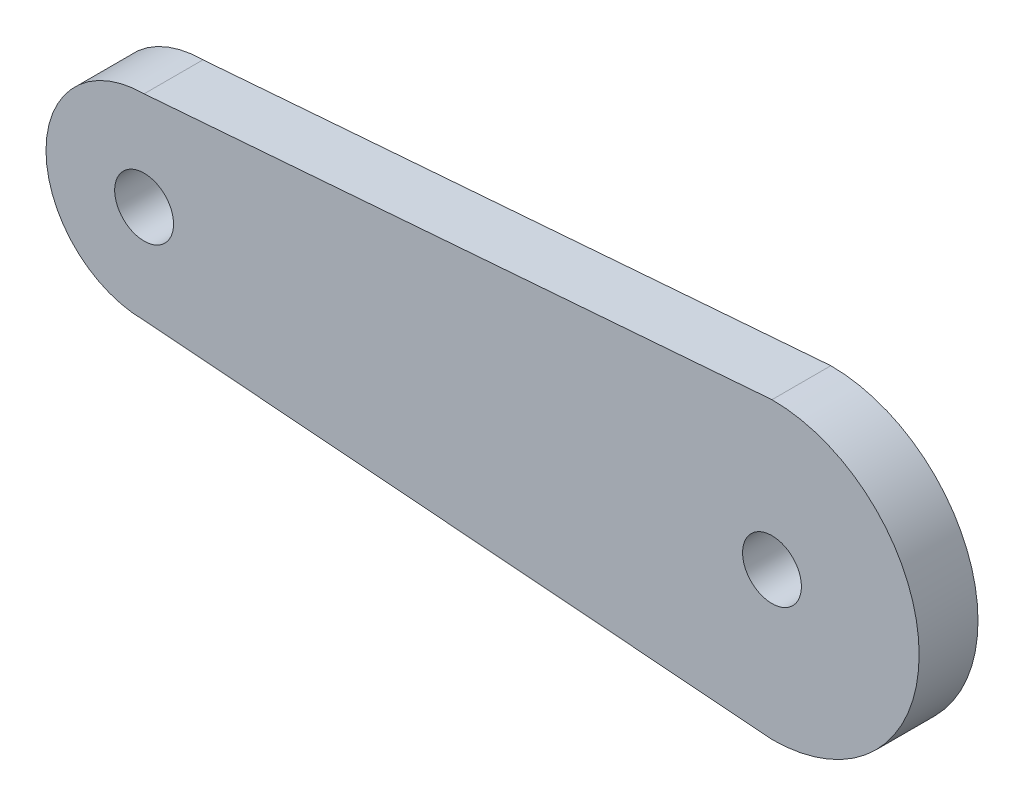
ISO-10303-21;
HEADER;
FILE_DESCRIPTION(('STEP AP214'),'2;1');
FILE_NAME('part.step','',(''),(''),'','','');
FILE_SCHEMA(('AUTOMOTIVE_DESIGN { 1 0 10303 214 1 1 1 1 }'));
ENDSEC;
DATA;
#1=APPLICATION_CONTEXT('core data for automotive mechanical design processes');
#2=APPLICATION_PROTOCOL_DEFINITION('international standard','automotive_design',2000,#1);
#3=PRODUCT_CONTEXT('',#1,'mechanical');
#4=PRODUCT('Part','Part','',(#3));
#5=PRODUCT_RELATED_PRODUCT_CATEGORY('part','',(#4));
#6=PRODUCT_DEFINITION_FORMATION('','',#4);
#7=PRODUCT_DEFINITION_CONTEXT('part definition',#1,'design');
#8=PRODUCT_DEFINITION('design','',#6,#7);
#9=PRODUCT_DEFINITION_SHAPE('','',#8);
#10=(LENGTH_UNIT() NAMED_UNIT(*) SI_UNIT(.MILLI.,.METRE.));
#11=(NAMED_UNIT(*) PLANE_ANGLE_UNIT() SI_UNIT($,.RADIAN.));
#12=(NAMED_UNIT(*) SI_UNIT($,.STERADIAN.) SOLID_ANGLE_UNIT());
#13=UNCERTAINTY_MEASURE_WITH_UNIT(LENGTH_MEASURE(1.E-05),#10,'distance_accuracy_value','');
#14=(GEOMETRIC_REPRESENTATION_CONTEXT(3) GLOBAL_UNCERTAINTY_ASSIGNED_CONTEXT((#13)) GLOBAL_UNIT_ASSIGNED_CONTEXT((#10,
#11,#12)) REPRESENTATION_CONTEXT('',''));
#15=CARTESIAN_POINT('',(0.,0.,0.));
#16=DIRECTION('',(0.,0.,1.));
#17=DIRECTION('',(1.,0.,0.));
#18=AXIS2_PLACEMENT_3D('',#15,#16,#17);
#19=CARTESIAN_POINT('',(32.,0.,3.));
#20=DIRECTION('',(0.,0.,-1.));
#21=DIRECTION('',(-1.,0.,0.));
#22=AXIS2_PLACEMENT_3D('',#19,#20,#21);
#23=CYLINDRICAL_SURFACE('',#22,7.5);
#24=CARTESIAN_POINT('',(32.,0.,0.));
#25=DIRECTION('',(0.,0.,1.));
#26=DIRECTION('',(1.,0.,0.));
#27=AXIS2_PLACEMENT_3D('',#24,#25,#26);
#28=CIRCLE('',#27,7.5);
#29=CARTESIAN_POINT('',(32.,7.5,0.));
#30=VERTEX_POINT('',#29);
#31=CARTESIAN_POINT('',(32.,-7.5,0.));
#32=VERTEX_POINT('',#31);
#33=EDGE_CURVE('E109',#30,#32,#28,.F.);
#34=ORIENTED_EDGE('',*,*,#33,.F.);
#35=DIRECTION('',(0.,0.,-1.));
#36=VECTOR('',#35,1.);
#37=CARTESIAN_POINT('',(32.,7.5,3.));
#38=LINE('',#37,#36);
#39=CARTESIAN_POINT('',(32.,7.5,3.));
#40=VERTEX_POINT('',#39);
#41=EDGE_CURVE('E11',#40,#30,#38,.T.);
#42=ORIENTED_EDGE('',*,*,#41,.F.);
#43=CARTESIAN_POINT('',(32.,0.,3.));
#44=DIRECTION('',(0.,0.,1.));
#45=DIRECTION('',(1.,0.,0.));
#46=AXIS2_PLACEMENT_3D('',#43,#44,#45);
#47=CIRCLE('',#46,7.5);
#48=CARTESIAN_POINT('',(32.,-7.5,3.));
#49=VERTEX_POINT('',#48);
#50=EDGE_CURVE('E97',#40,#49,#47,.F.);
#51=ORIENTED_EDGE('',*,*,#50,.T.);
#52=DIRECTION('',(0.,0.,-1.));
#53=VECTOR('',#52,1.);
#54=CARTESIAN_POINT('',(32.,-7.5,3.));
#55=LINE('',#54,#53);
#56=EDGE_CURVE('E77',#49,#32,#55,.T.);
#57=ORIENTED_EDGE('',*,*,#56,.T.);
#58=EDGE_LOOP('',(#34,#42,#51,#57));
#59=FACE_BOUND('',#58,.T.);
#60=ADVANCED_FACE('F39',(#59),#23,.T.);
#61=CARTESIAN_POINT('',(-0.388255277845183,4.96966755641835,3.));
#62=DIRECTION('',(-0.0778876672929096,0.996962141349243,0.));
#63=DIRECTION('',(-0.996962141349244,-0.0778876672929096,0.));
#64=AXIS2_PLACEMENT_3D('',#61,#62,#63);
#65=PLANE('',#64);
#66=DIRECTION('',(0.996962141349244,0.0778876672929096,0.));
#67=VECTOR('',#66,1.);
#68=CARTESIAN_POINT('',(-0.388255277845183,4.96966755641835,0.));
#69=LINE('',#68,#67);
#70=CARTESIAN_POINT('',(0.,5.,0.));
#71=VERTEX_POINT('',#70);
#72=EDGE_CURVE('E90',#71,#30,#69,.T.);
#73=ORIENTED_EDGE('',*,*,#72,.F.);
#74=DIRECTION('',(0.,0.,-1.));
#75=VECTOR('',#74,1.);
#76=CARTESIAN_POINT('',(0.,5.,3.));
#77=LINE('',#76,#75);
#78=CARTESIAN_POINT('',(0.,5.,3.));
#79=VERTEX_POINT('',#78);
#80=EDGE_CURVE('E47',#79,#71,#77,.T.);
#81=ORIENTED_EDGE('',*,*,#80,.F.);
#82=DIRECTION('',(0.996962141349244,0.0778876672929096,0.));
#83=VECTOR('',#82,1.);
#84=CARTESIAN_POINT('',(-0.388255277845183,4.96966755641835,3.));
#85=LINE('',#84,#83);
#86=EDGE_CURVE('E88',#79,#40,#85,.T.);
#87=ORIENTED_EDGE('',*,*,#86,.T.);
#88=ORIENTED_EDGE('',*,*,#41,.T.);
#89=EDGE_LOOP('',(#73,#81,#87,#88));
#90=FACE_BOUND('',#89,.T.);
#91=ADVANCED_FACE('F86',(#90),#65,.T.);
#92=CARTESIAN_POINT('',(0.,0.,3.));
#93=DIRECTION('',(0.,0.,-1.));
#94=DIRECTION('',(-1.,0.,0.));
#95=AXIS2_PLACEMENT_3D('',#92,#93,#94);
#96=CYLINDRICAL_SURFACE('',#95,5.);
#97=CARTESIAN_POINT('',(0.,0.,0.));
#98=DIRECTION('',(0.,0.,1.));
#99=DIRECTION('',(1.,0.,0.));
#100=AXIS2_PLACEMENT_3D('',#97,#98,#99);
#101=CIRCLE('',#100,5.);
#102=CARTESIAN_POINT('',(0.,-5.,0.));
#103=VERTEX_POINT('',#102);
#104=EDGE_CURVE('E70',#71,#103,#101,.T.);
#105=ORIENTED_EDGE('',*,*,#104,.T.);
#106=DIRECTION('',(0.,0.,-1.));
#107=VECTOR('',#106,1.);
#108=CARTESIAN_POINT('',(0.,-5.,3.));
#109=LINE('',#108,#107);
#110=CARTESIAN_POINT('',(0.,-5.,3.));
#111=VERTEX_POINT('',#110);
#112=EDGE_CURVE('E91',#111,#103,#109,.T.);
#113=ORIENTED_EDGE('',*,*,#112,.F.);
#114=CARTESIAN_POINT('',(0.,0.,3.));
#115=DIRECTION('',(0.,0.,1.));
#116=DIRECTION('',(1.,0.,0.));
#117=AXIS2_PLACEMENT_3D('',#114,#115,#116);
#118=CIRCLE('',#117,5.);
#119=EDGE_CURVE('E92',#79,#111,#118,.T.);
#120=ORIENTED_EDGE('',*,*,#119,.F.);
#121=ORIENTED_EDGE('',*,*,#80,.T.);
#122=EDGE_LOOP('',(#105,#113,#120,#121));
#123=FACE_BOUND('',#122,.T.);
#124=ADVANCED_FACE('F93',(#123),#96,.T.);
#125=CARTESIAN_POINT('',(32.,0.,3.));
#126=DIRECTION('',(0.,0.,-1.));
#127=DIRECTION('',(-1.,0.,0.));
#128=AXIS2_PLACEMENT_3D('',#125,#126,#127);
#129=CYLINDRICAL_SURFACE('',#128,1.5);
#130=CARTESIAN_POINT('',(32.,0.,3.));
#131=DIRECTION('',(0.,0.,1.));
#132=DIRECTION('',(1.,0.,0.));
#133=AXIS2_PLACEMENT_3D('',#130,#131,#132);
#134=CIRCLE('',#133,1.5);
#135=CARTESIAN_POINT('',(33.5,0.,3.));
#136=VERTEX_POINT('',#135);
#137=EDGE_CURVE('E103',#136,#136,#134,.T.);
#138=ORIENTED_EDGE('',*,*,#137,.T.);
#139=EDGE_LOOP('',(#138));
#140=FACE_BOUND('',#139,.T.);
#141=CARTESIAN_POINT('',(32.,0.,0.));
#142=DIRECTION('',(0.,0.,1.));
#143=DIRECTION('',(1.,0.,0.));
#144=AXIS2_PLACEMENT_3D('',#141,#142,#143);
#145=CIRCLE('',#144,1.5);
#146=CARTESIAN_POINT('',(33.5,0.,0.));
#147=VERTEX_POINT('',#146);
#148=EDGE_CURVE('E116',#147,#147,#145,.T.);
#149=ORIENTED_EDGE('',*,*,#148,.F.);
#150=EDGE_LOOP('',(#149));
#151=FACE_BOUND('',#150,.T.);
#152=ADVANCED_FACE('F135',(#140,#151),#129,.F.);
#153=CARTESIAN_POINT('',(-0.388255277845183,-4.96966755641835,3.));
#154=DIRECTION('',(0.0778876672929096,0.996962141349243,0.));
#155=DIRECTION('',(-0.996962141349244,0.0778876672929096,0.));
#156=AXIS2_PLACEMENT_3D('',#153,#154,#155);
#157=PLANE('',#156);
#158=DIRECTION('',(0.996962141349244,-0.0778876672929096,0.));
#159=VECTOR('',#158,1.);
#160=CARTESIAN_POINT('',(-0.388255277845183,-4.96966755641835,0.));
#161=LINE('',#160,#159);
#162=EDGE_CURVE('E114',#103,#32,#161,.T.);
#163=ORIENTED_EDGE('',*,*,#162,.T.);
#164=ORIENTED_EDGE('',*,*,#56,.F.);
#165=DIRECTION('',(0.996962141349244,-0.0778876672929096,0.));
#166=VECTOR('',#165,1.);
#167=CARTESIAN_POINT('',(-0.388255277845183,-4.96966755641835,3.));
#168=LINE('',#167,#166);
#169=EDGE_CURVE('E55',#111,#49,#168,.T.);
#170=ORIENTED_EDGE('',*,*,#169,.F.);
#171=ORIENTED_EDGE('',*,*,#112,.T.);
#172=EDGE_LOOP('',(#163,#164,#170,#171));
#173=FACE_BOUND('',#172,.T.);
#174=ADVANCED_FACE('F124',(#173),#157,.F.);
#175=CARTESIAN_POINT('',(0.,0.,3.));
#176=DIRECTION('',(0.,0.,-1.));
#177=DIRECTION('',(-1.,0.,0.));
#178=AXIS2_PLACEMENT_3D('',#175,#176,#177);
#179=CYLINDRICAL_SURFACE('',#178,1.5);
#180=CARTESIAN_POINT('',(0.,0.,3.));
#181=DIRECTION('',(0.,0.,1.));
#182=DIRECTION('',(1.,0.,0.));
#183=AXIS2_PLACEMENT_3D('',#180,#181,#182);
#184=CIRCLE('',#183,1.5);
#185=CARTESIAN_POINT('',(1.5,0.,3.));
#186=VERTEX_POINT('',#185);
#187=EDGE_CURVE('E106',#186,#186,#184,.T.);
#188=ORIENTED_EDGE('',*,*,#187,.T.);
#189=EDGE_LOOP('',(#188));
#190=FACE_BOUND('',#189,.T.);
#191=CARTESIAN_POINT('',(0.,0.,0.));
#192=DIRECTION('',(0.,0.,1.));
#193=DIRECTION('',(1.,0.,0.));
#194=AXIS2_PLACEMENT_3D('',#191,#192,#193);
#195=CIRCLE('',#194,1.5);
#196=CARTESIAN_POINT('',(1.5,0.,0.));
#197=VERTEX_POINT('',#196);
#198=EDGE_CURVE('E99',#197,#197,#195,.T.);
#199=ORIENTED_EDGE('',*,*,#198,.F.);
#200=EDGE_LOOP('',(#199));
#201=FACE_BOUND('',#200,.T.);
#202=ADVANCED_FACE('F140',(#190,#201),#179,.F.);
#203=CARTESIAN_POINT('',(0.,0.,3.));
#204=DIRECTION('',(0.,0.,1.));
#205=DIRECTION('',(1.,0.,0.));
#206=AXIS2_PLACEMENT_3D('',#203,#204,#205);
#207=PLANE('',#206);
#208=ORIENTED_EDGE('',*,*,#50,.F.);
#209=ORIENTED_EDGE('',*,*,#86,.F.);
#210=ORIENTED_EDGE('',*,*,#119,.T.);
#211=ORIENTED_EDGE('',*,*,#169,.T.);
#212=EDGE_LOOP('',(#208,#209,#210,#211));
#213=FACE_BOUND('',#212,.T.);
#214=ORIENTED_EDGE('',*,*,#137,.F.);
#215=EDGE_LOOP('',(#214));
#216=FACE_BOUND('',#215,.T.);
#217=ORIENTED_EDGE('',*,*,#187,.F.);
#218=EDGE_LOOP('',(#217));
#219=FACE_BOUND('',#218,.T.);
#220=ADVANCED_FACE('F95',(#213,#216,#219),#207,.T.);
#221=CARTESIAN_POINT('',(0.,0.,0.));
#222=DIRECTION('',(0.,0.,1.));
#223=DIRECTION('',(1.,0.,0.));
#224=AXIS2_PLACEMENT_3D('',#221,#222,#223);
#225=PLANE('',#224);
#226=ORIENTED_EDGE('',*,*,#33,.T.);
#227=ORIENTED_EDGE('',*,*,#162,.F.);
#228=ORIENTED_EDGE('',*,*,#104,.F.);
#229=ORIENTED_EDGE('',*,*,#72,.T.);
#230=EDGE_LOOP('',(#226,#227,#228,#229));
#231=FACE_BOUND('',#230,.T.);
#232=ORIENTED_EDGE('',*,*,#148,.T.);
#233=EDGE_LOOP('',(#232));
#234=FACE_BOUND('',#233,.T.);
#235=ORIENTED_EDGE('',*,*,#198,.T.);
#236=EDGE_LOOP('',(#235));
#237=FACE_BOUND('',#236,.T.);
#238=ADVANCED_FACE('F126',(#231,#234,#237),#225,.F.);
#239=CLOSED_SHELL('',(#60,#91,#124,#152,#174,#202,#220,#238));
#240=MANIFOLD_SOLID_BREP('B2',#239);
#241=ADVANCED_BREP_SHAPE_REPRESENTATION('',(#18,#240),#14);
#242=SHAPE_DEFINITION_REPRESENTATION(#9,#241);
ENDSEC;
END-ISO-10303-21;
